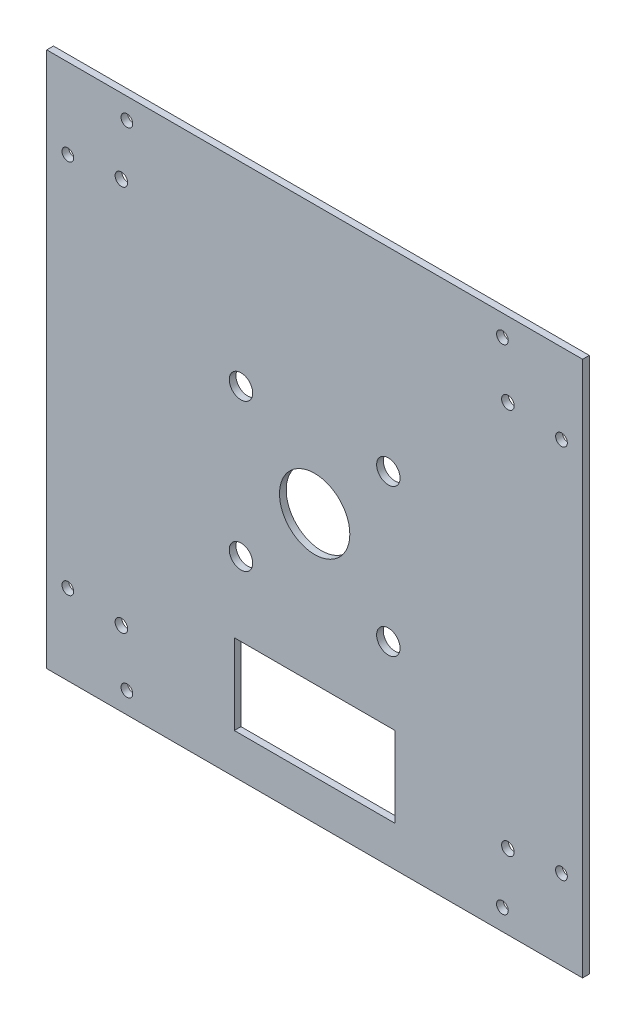
ISO-10303-21;
HEADER;
FILE_DESCRIPTION(('STEP AP214'),'2;1');
FILE_NAME('part.step','',(''),(''),'','','');
FILE_SCHEMA(('AUTOMOTIVE_DESIGN { 1 0 10303 214 1 1 1 1 }'));
ENDSEC;
DATA;
#1=APPLICATION_CONTEXT('core data for automotive mechanical design processes');
#2=APPLICATION_PROTOCOL_DEFINITION('international standard','automotive_design',2000,#1);
#3=PRODUCT_CONTEXT('',#1,'mechanical');
#4=PRODUCT('Part','Part','',(#3));
#5=PRODUCT_RELATED_PRODUCT_CATEGORY('part','',(#4));
#6=PRODUCT_DEFINITION_FORMATION('','',#4);
#7=PRODUCT_DEFINITION_CONTEXT('part definition',#1,'design');
#8=PRODUCT_DEFINITION('design','',#6,#7);
#9=PRODUCT_DEFINITION_SHAPE('','',#8);
#10=(LENGTH_UNIT() NAMED_UNIT(*) SI_UNIT(.MILLI.,.METRE.));
#11=(NAMED_UNIT(*) PLANE_ANGLE_UNIT() SI_UNIT($,.RADIAN.));
#12=(NAMED_UNIT(*) SI_UNIT($,.STERADIAN.) SOLID_ANGLE_UNIT());
#13=UNCERTAINTY_MEASURE_WITH_UNIT(LENGTH_MEASURE(1.E-05),#10,'distance_accuracy_value','');
#14=(GEOMETRIC_REPRESENTATION_CONTEXT(3) GLOBAL_UNCERTAINTY_ASSIGNED_CONTEXT((#13)) GLOBAL_UNIT_ASSIGNED_CONTEXT((#10,
#11,#12)) REPRESENTATION_CONTEXT('',''));
#15=CARTESIAN_POINT('',(0.,0.,0.));
#16=DIRECTION('',(0.,0.,1.));
#17=DIRECTION('',(1.,0.,0.));
#18=AXIS2_PLACEMENT_3D('',#15,#16,#17);
#19=CARTESIAN_POINT('',(0.,0.,-1.5875));
#20=DIRECTION('',(0.,0.,1.));
#21=DIRECTION('',(1.,0.,0.));
#22=AXIS2_PLACEMENT_3D('',#19,#20,#21);
#23=PLANE('',#22);
#24=DIRECTION('',(0.,1.,0.));
#25=VECTOR('',#24,1.);
#26=CARTESIAN_POINT('',(-127.,0.,-1.5875));
#27=LINE('',#26,#25);
#28=CARTESIAN_POINT('',(-127.,127.,-1.5875));
#29=VERTEX_POINT('',#28);
#30=CARTESIAN_POINT('',(-127.,-127.,-1.5875));
#31=VERTEX_POINT('',#30);
#32=EDGE_CURVE('E668',#29,#31,#27,.F.);
#33=ORIENTED_EDGE('',*,*,#32,.F.);
#34=DIRECTION('',(1.,0.,0.));
#35=VECTOR('',#34,1.);
#36=CARTESIAN_POINT('',(0.,127.,-1.5875));
#37=LINE('',#36,#35);
#38=CARTESIAN_POINT('',(127.,127.,-1.5875));
#39=VERTEX_POINT('',#38);
#40=EDGE_CURVE('E676',#39,#29,#37,.F.);
#41=ORIENTED_EDGE('',*,*,#40,.F.);
#42=DIRECTION('',(0.,1.,0.));
#43=VECTOR('',#42,1.);
#44=CARTESIAN_POINT('',(127.,0.,-1.5875));
#45=LINE('',#44,#43);
#46=CARTESIAN_POINT('',(127.,-127.,-1.5875));
#47=VERTEX_POINT('',#46);
#48=EDGE_CURVE('E679',#39,#47,#45,.F.);
#49=ORIENTED_EDGE('',*,*,#48,.T.);
#50=DIRECTION('',(1.,0.,0.));
#51=VECTOR('',#50,1.);
#52=CARTESIAN_POINT('',(0.,-127.,-1.5875));
#53=LINE('',#52,#51);
#54=EDGE_CURVE('E686',#47,#31,#53,.F.);
#55=ORIENTED_EDGE('',*,*,#54,.T.);
#56=EDGE_LOOP('',(#33,#41,#49,#55));
#57=FACE_BOUND('',#56,.T.);
#58=DIRECTION('',(1.,0.,0.));
#59=VECTOR('',#58,1.);
#60=CARTESIAN_POINT('',(0.,-69.85,-1.5875));
#61=LINE('',#60,#59);
#62=CARTESIAN_POINT('',(38.1,-69.85,-1.5875));
#63=VERTEX_POINT('',#62);
#64=CARTESIAN_POINT('',(-38.1,-69.85,-1.5875));
#65=VERTEX_POINT('',#64);
#66=EDGE_CURVE('E688',#63,#65,#61,.F.);
#67=ORIENTED_EDGE('',*,*,#66,.T.);
#68=DIRECTION('',(0.,1.,0.));
#69=VECTOR('',#68,1.);
#70=CARTESIAN_POINT('',(-38.1,0.,-1.5875));
#71=LINE('',#70,#69);
#72=CARTESIAN_POINT('',(-38.1,-107.95,-1.5875));
#73=VERTEX_POINT('',#72);
#74=EDGE_CURVE('E106',#65,#73,#71,.F.);
#75=ORIENTED_EDGE('',*,*,#74,.T.);
#76=DIRECTION('',(1.,0.,0.));
#77=VECTOR('',#76,1.);
#78=CARTESIAN_POINT('',(0.,-107.95,-1.5875));
#79=LINE('',#78,#77);
#80=CARTESIAN_POINT('',(38.1,-107.95,-1.5875));
#81=VERTEX_POINT('',#80);
#82=EDGE_CURVE('E97',#81,#73,#79,.F.);
#83=ORIENTED_EDGE('',*,*,#82,.F.);
#84=DIRECTION('',(0.,1.,0.));
#85=VECTOR('',#84,1.);
#86=CARTESIAN_POINT('',(38.1,0.,-1.5875));
#87=LINE('',#86,#85);
#88=EDGE_CURVE('E104',#63,#81,#87,.F.);
#89=ORIENTED_EDGE('',*,*,#88,.F.);
#90=EDGE_LOOP('',(#67,#75,#83,#89));
#91=FACE_BOUND('',#90,.T.);
#92=CARTESIAN_POINT('',(-89.,117.,-1.5875));
#93=DIRECTION('',(0.,0.,1.));
#94=DIRECTION('',(1.,0.,0.));
#95=AXIS2_PLACEMENT_3D('',#92,#93,#94);
#96=CIRCLE('',#95,2.77812500000001);
#97=CARTESIAN_POINT('',(-86.221875,117.,-1.5875));
#98=VERTEX_POINT('',#97);
#99=EDGE_CURVE('E118',#98,#98,#96,.T.);
#100=ORIENTED_EDGE('',*,*,#99,.T.);
#101=EDGE_LOOP('',(#100));
#102=FACE_BOUND('',#101,.T.);
#103=CARTESIAN_POINT('',(-89.,-117.,-1.5875));
#104=DIRECTION('',(0.,0.,1.));
#105=DIRECTION('',(1.,0.,0.));
#106=AXIS2_PLACEMENT_3D('',#103,#104,#105);
#107=CIRCLE('',#106,2.77812500000001);
#108=CARTESIAN_POINT('',(-86.221875,-117.,-1.5875));
#109=VERTEX_POINT('',#108);
#110=EDGE_CURVE('E206',#109,#109,#107,.T.);
#111=ORIENTED_EDGE('',*,*,#110,.T.);
#112=EDGE_LOOP('',(#111));
#113=FACE_BOUND('',#112,.T.);
#114=CARTESIAN_POINT('',(-117.,-89.,-1.5875));
#115=DIRECTION('',(0.,0.,1.));
#116=DIRECTION('',(1.,0.,0.));
#117=AXIS2_PLACEMENT_3D('',#114,#115,#116);
#118=CIRCLE('',#117,2.77812500000001);
#119=CARTESIAN_POINT('',(-114.221875,-89.,-1.5875));
#120=VERTEX_POINT('',#119);
#121=EDGE_CURVE('E210',#120,#120,#118,.T.);
#122=ORIENTED_EDGE('',*,*,#121,.T.);
#123=EDGE_LOOP('',(#122));
#124=FACE_BOUND('',#123,.T.);
#125=CARTESIAN_POINT('',(116.999999999999,-89.0000000000006,-1.5875));
#126=DIRECTION('',(0.,0.,1.));
#127=DIRECTION('',(1.,0.,0.));
#128=AXIS2_PLACEMENT_3D('',#125,#126,#127);
#129=CIRCLE('',#128,2.77812500000001);
#130=CARTESIAN_POINT('',(119.778124999999,-89.0000000000006,-1.5875));
#131=VERTEX_POINT('',#130);
#132=EDGE_CURVE('E214',#131,#131,#129,.T.);
#133=ORIENTED_EDGE('',*,*,#132,.T.);
#134=EDGE_LOOP('',(#133));
#135=FACE_BOUND('',#134,.T.);
#136=CARTESIAN_POINT('',(-117.,89.,-1.5875));
#137=DIRECTION('',(0.,0.,1.));
#138=DIRECTION('',(1.,0.,0.));
#139=AXIS2_PLACEMENT_3D('',#136,#137,#138);
#140=CIRCLE('',#139,2.77812500000001);
#141=CARTESIAN_POINT('',(-114.221875,89.,-1.5875));
#142=VERTEX_POINT('',#141);
#143=EDGE_CURVE('E218',#142,#142,#140,.T.);
#144=ORIENTED_EDGE('',*,*,#143,.T.);
#145=EDGE_LOOP('',(#144));
#146=FACE_BOUND('',#145,.T.);
#147=CARTESIAN_POINT('',(116.999999999999,89.0000000000006,-1.5875));
#148=DIRECTION('',(0.,0.,1.));
#149=DIRECTION('',(1.,0.,0.));
#150=AXIS2_PLACEMENT_3D('',#147,#148,#149);
#151=CIRCLE('',#150,2.77812500000001);
#152=CARTESIAN_POINT('',(119.778124999999,89.0000000000006,-1.5875));
#153=VERTEX_POINT('',#152);
#154=EDGE_CURVE('E222',#153,#153,#151,.T.);
#155=ORIENTED_EDGE('',*,*,#154,.T.);
#156=EDGE_LOOP('',(#155));
#157=FACE_BOUND('',#156,.T.);
#158=CARTESIAN_POINT('',(88.9999999999992,117.,-1.5875));
#159=DIRECTION('',(0.,0.,1.));
#160=DIRECTION('',(1.,0.,0.));
#161=AXIS2_PLACEMENT_3D('',#158,#159,#160);
#162=CIRCLE('',#161,2.77812500000001);
#163=CARTESIAN_POINT('',(91.7781249999992,117.,-1.5875));
#164=VERTEX_POINT('',#163);
#165=EDGE_CURVE('E226',#164,#164,#162,.T.);
#166=ORIENTED_EDGE('',*,*,#165,.T.);
#167=EDGE_LOOP('',(#166));
#168=FACE_BOUND('',#167,.T.);
#169=CARTESIAN_POINT('',(88.9999999999992,-117.,-1.5875));
#170=DIRECTION('',(0.,0.,1.));
#171=DIRECTION('',(1.,0.,0.));
#172=AXIS2_PLACEMENT_3D('',#169,#170,#171);
#173=CIRCLE('',#172,2.77812500000001);
#174=CARTESIAN_POINT('',(91.7781249999992,-117.,-1.5875));
#175=VERTEX_POINT('',#174);
#176=EDGE_CURVE('E230',#175,#175,#173,.T.);
#177=ORIENTED_EDGE('',*,*,#176,.T.);
#178=EDGE_LOOP('',(#177));
#179=FACE_BOUND('',#178,.T.);
#180=CARTESIAN_POINT('',(-91.6,91.6,-1.5875));
#181=DIRECTION('',(0.,0.,1.));
#182=DIRECTION('',(1.,0.,0.));
#183=AXIS2_PLACEMENT_3D('',#180,#181,#182);
#184=CIRCLE('',#183,2.97688);
#185=CARTESIAN_POINT('',(-88.62312,91.6,-1.5875));
#186=VERTEX_POINT('',#185);
#187=EDGE_CURVE('E234',#186,#186,#184,.T.);
#188=ORIENTED_EDGE('',*,*,#187,.T.);
#189=EDGE_LOOP('',(#188));
#190=FACE_BOUND('',#189,.T.);
#191=CARTESIAN_POINT('',(91.5999999999994,91.6000000000006,-1.5875));
#192=DIRECTION('',(0.,0.,1.));
#193=DIRECTION('',(1.,0.,0.));
#194=AXIS2_PLACEMENT_3D('',#191,#192,#193);
#195=CIRCLE('',#194,2.97688);
#196=CARTESIAN_POINT('',(94.5768799999994,91.6000000000006,-1.5875));
#197=VERTEX_POINT('',#196);
#198=EDGE_CURVE('E238',#197,#197,#195,.T.);
#199=ORIENTED_EDGE('',*,*,#198,.T.);
#200=EDGE_LOOP('',(#199));
#201=FACE_BOUND('',#200,.T.);
#202=CARTESIAN_POINT('',(91.5999999999994,-91.6000000000006,-1.5875));
#203=DIRECTION('',(0.,0.,1.));
#204=DIRECTION('',(1.,0.,0.));
#205=AXIS2_PLACEMENT_3D('',#202,#203,#204);
#206=CIRCLE('',#205,2.97688);
#207=CARTESIAN_POINT('',(94.5768799999994,-91.6000000000006,-1.5875));
#208=VERTEX_POINT('',#207);
#209=EDGE_CURVE('E242',#208,#208,#206,.T.);
#210=ORIENTED_EDGE('',*,*,#209,.T.);
#211=EDGE_LOOP('',(#210));
#212=FACE_BOUND('',#211,.T.);
#213=CARTESIAN_POINT('',(-91.6,-91.6,-1.5875));
#214=DIRECTION('',(0.,0.,1.));
#215=DIRECTION('',(1.,0.,0.));
#216=AXIS2_PLACEMENT_3D('',#213,#214,#215);
#217=CIRCLE('',#216,2.97688);
#218=CARTESIAN_POINT('',(-88.62312,-91.6,-1.5875));
#219=VERTEX_POINT('',#218);
#220=EDGE_CURVE('E246',#219,#219,#217,.T.);
#221=ORIENTED_EDGE('',*,*,#220,.T.);
#222=EDGE_LOOP('',(#221));
#223=FACE_BOUND('',#222,.T.);
#224=CARTESIAN_POINT('',(0.,0.,-1.5875));
#225=DIRECTION('',(0.,0.,1.));
#226=DIRECTION('',(1.,0.,0.));
#227=AXIS2_PLACEMENT_3D('',#224,#225,#226);
#228=CIRCLE('',#227,16.66875);
#229=CARTESIAN_POINT('',(16.66875,0.,-1.5875));
#230=VERTEX_POINT('',#229);
#231=EDGE_CURVE('E250',#230,#230,#228,.T.);
#232=ORIENTED_EDGE('',*,*,#231,.T.);
#233=EDGE_LOOP('',(#232));
#234=FACE_BOUND('',#233,.T.);
#235=CARTESIAN_POINT('',(-34.925,34.925,-1.5875));
#236=DIRECTION('',(0.,0.,1.));
#237=DIRECTION('',(1.,0.,0.));
#238=AXIS2_PLACEMENT_3D('',#235,#236,#237);
#239=CIRCLE('',#238,5.55625);
#240=CARTESIAN_POINT('',(-29.36875,34.925,-1.5875));
#241=VERTEX_POINT('',#240);
#242=EDGE_CURVE('E254',#241,#241,#239,.T.);
#243=ORIENTED_EDGE('',*,*,#242,.T.);
#244=EDGE_LOOP('',(#243));
#245=FACE_BOUND('',#244,.T.);
#246=CARTESIAN_POINT('',(34.9249999999997,34.9250000000002,-1.5875));
#247=DIRECTION('',(0.,0.,1.));
#248=DIRECTION('',(1.,0.,0.));
#249=AXIS2_PLACEMENT_3D('',#246,#247,#248);
#250=CIRCLE('',#249,5.55625);
#251=CARTESIAN_POINT('',(40.4812499999997,34.9250000000002,-1.5875));
#252=VERTEX_POINT('',#251);
#253=EDGE_CURVE('E258',#252,#252,#250,.T.);
#254=ORIENTED_EDGE('',*,*,#253,.T.);
#255=EDGE_LOOP('',(#254));
#256=FACE_BOUND('',#255,.T.);
#257=CARTESIAN_POINT('',(34.9249999999997,-34.9250000000002,-1.5875));
#258=DIRECTION('',(0.,0.,1.));
#259=DIRECTION('',(1.,0.,0.));
#260=AXIS2_PLACEMENT_3D('',#257,#258,#259);
#261=CIRCLE('',#260,5.55625);
#262=CARTESIAN_POINT('',(40.4812499999997,-34.9250000000002,-1.5875));
#263=VERTEX_POINT('',#262);
#264=EDGE_CURVE('E261',#263,#263,#261,.T.);
#265=ORIENTED_EDGE('',*,*,#264,.T.);
#266=EDGE_LOOP('',(#265));
#267=FACE_BOUND('',#266,.T.);
#268=CARTESIAN_POINT('',(-34.925,-34.925,-1.5875));
#269=DIRECTION('',(0.,0.,1.));
#270=DIRECTION('',(1.,0.,0.));
#271=AXIS2_PLACEMENT_3D('',#268,#269,#270);
#272=CIRCLE('',#271,5.55625);
#273=CARTESIAN_POINT('',(-29.36875,-34.925,-1.5875));
#274=VERTEX_POINT('',#273);
#275=EDGE_CURVE('E20',#274,#274,#272,.T.);
#276=ORIENTED_EDGE('',*,*,#275,.T.);
#277=EDGE_LOOP('',(#276));
#278=FACE_BOUND('',#277,.T.);
#279=ADVANCED_FACE('F17',(#57,#91,#102,#113,#124,#135,#146,#157,#168,#179,#190,#201,#212,#223,
#234,#245,#256,#267,#278),#23,.F.);
#280=CARTESIAN_POINT('',(-34.925,-34.925,-23.8125));
#281=DIRECTION('',(0.,0.,1.));
#282=DIRECTION('',(1.,0.,0.));
#283=AXIS2_PLACEMENT_3D('',#280,#281,#282);
#284=CYLINDRICAL_SURFACE('',#283,5.55625);
#285=CARTESIAN_POINT('',(-34.925,-34.925,1.5875));
#286=DIRECTION('',(0.,0.,1.));
#287=DIRECTION('',(1.,0.,0.));
#288=AXIS2_PLACEMENT_3D('',#285,#286,#287);
#289=CIRCLE('',#288,5.55625);
#290=CARTESIAN_POINT('',(-29.36875,-34.925,1.5875));
#291=VERTEX_POINT('',#290);
#292=EDGE_CURVE('E199',#291,#291,#289,.F.);
#293=ORIENTED_EDGE('',*,*,#292,.F.);
#294=EDGE_LOOP('',(#293));
#295=FACE_BOUND('',#294,.T.);
#296=ORIENTED_EDGE('',*,*,#275,.F.);
#297=EDGE_LOOP('',(#296));
#298=FACE_BOUND('',#297,.T.);
#299=ADVANCED_FACE('F272',(#295,#298),#284,.F.);
#300=CARTESIAN_POINT('',(34.9249999999997,-34.9250000000002,-23.8125));
#301=DIRECTION('',(0.,0.,1.));
#302=DIRECTION('',(1.,0.,0.));
#303=AXIS2_PLACEMENT_3D('',#300,#301,#302);
#304=CYLINDRICAL_SURFACE('',#303,5.55625);
#305=CARTESIAN_POINT('',(34.9249999999997,-34.9250000000002,1.5875));
#306=DIRECTION('',(0.,0.,1.));
#307=DIRECTION('',(1.,0.,0.));
#308=AXIS2_PLACEMENT_3D('',#305,#306,#307);
#309=CIRCLE('',#308,5.55625);
#310=CARTESIAN_POINT('',(40.4812499999997,-34.9250000000002,1.5875));
#311=VERTEX_POINT('',#310);
#312=EDGE_CURVE('E195',#311,#311,#309,.F.);
#313=ORIENTED_EDGE('',*,*,#312,.F.);
#314=EDGE_LOOP('',(#313));
#315=FACE_BOUND('',#314,.T.);
#316=ORIENTED_EDGE('',*,*,#264,.F.);
#317=EDGE_LOOP('',(#316));
#318=FACE_BOUND('',#317,.T.);
#319=ADVANCED_FACE('F274',(#315,#318),#304,.F.);
#320=CARTESIAN_POINT('',(34.9249999999997,34.9250000000002,-23.8125));
#321=DIRECTION('',(0.,0.,1.));
#322=DIRECTION('',(1.,0.,0.));
#323=AXIS2_PLACEMENT_3D('',#320,#321,#322);
#324=CYLINDRICAL_SURFACE('',#323,5.55625);
#325=CARTESIAN_POINT('',(34.9249999999997,34.9250000000002,1.5875));
#326=DIRECTION('',(0.,0.,1.));
#327=DIRECTION('',(1.,0.,0.));
#328=AXIS2_PLACEMENT_3D('',#325,#326,#327);
#329=CIRCLE('',#328,5.55625);
#330=CARTESIAN_POINT('',(40.4812499999997,34.9250000000002,1.5875));
#331=VERTEX_POINT('',#330);
#332=EDGE_CURVE('E191',#331,#331,#329,.F.);
#333=ORIENTED_EDGE('',*,*,#332,.F.);
#334=EDGE_LOOP('',(#333));
#335=FACE_BOUND('',#334,.T.);
#336=ORIENTED_EDGE('',*,*,#253,.F.);
#337=EDGE_LOOP('',(#336));
#338=FACE_BOUND('',#337,.T.);
#339=ADVANCED_FACE('F281',(#335,#338),#324,.F.);
#340=CARTESIAN_POINT('',(-34.925,34.925,-23.8125));
#341=DIRECTION('',(0.,0.,1.));
#342=DIRECTION('',(1.,0.,0.));
#343=AXIS2_PLACEMENT_3D('',#340,#341,#342);
#344=CYLINDRICAL_SURFACE('',#343,5.55625);
#345=CARTESIAN_POINT('',(-34.925,34.925,1.5875));
#346=DIRECTION('',(0.,0.,1.));
#347=DIRECTION('',(1.,0.,0.));
#348=AXIS2_PLACEMENT_3D('',#345,#346,#347);
#349=CIRCLE('',#348,5.55625);
#350=CARTESIAN_POINT('',(-29.36875,34.925,1.5875));
#351=VERTEX_POINT('',#350);
#352=EDGE_CURVE('E187',#351,#351,#349,.F.);
#353=ORIENTED_EDGE('',*,*,#352,.F.);
#354=EDGE_LOOP('',(#353));
#355=FACE_BOUND('',#354,.T.);
#356=ORIENTED_EDGE('',*,*,#242,.F.);
#357=EDGE_LOOP('',(#356));
#358=FACE_BOUND('',#357,.T.);
#359=ADVANCED_FACE('F373',(#355,#358),#344,.F.);
#360=CARTESIAN_POINT('',(0.,0.,-23.8125));
#361=DIRECTION('',(0.,0.,1.));
#362=DIRECTION('',(1.,0.,0.));
#363=AXIS2_PLACEMENT_3D('',#360,#361,#362);
#364=CYLINDRICAL_SURFACE('',#363,16.66875);
#365=CARTESIAN_POINT('',(0.,0.,1.5875));
#366=DIRECTION('',(0.,0.,1.));
#367=DIRECTION('',(1.,0.,0.));
#368=AXIS2_PLACEMENT_3D('',#365,#366,#367);
#369=CIRCLE('',#368,16.66875);
#370=CARTESIAN_POINT('',(16.66875,0.,1.5875));
#371=VERTEX_POINT('',#370);
#372=EDGE_CURVE('E183',#371,#371,#369,.F.);
#373=ORIENTED_EDGE('',*,*,#372,.F.);
#374=EDGE_LOOP('',(#373));
#375=FACE_BOUND('',#374,.T.);
#376=ORIENTED_EDGE('',*,*,#231,.F.);
#377=EDGE_LOOP('',(#376));
#378=FACE_BOUND('',#377,.T.);
#379=ADVANCED_FACE('F369',(#375,#378),#364,.F.);
#380=CARTESIAN_POINT('',(-91.6,-91.6,-23.8125));
#381=DIRECTION('',(0.,0.,1.));
#382=DIRECTION('',(1.,0.,0.));
#383=AXIS2_PLACEMENT_3D('',#380,#381,#382);
#384=CYLINDRICAL_SURFACE('',#383,2.97688);
#385=CARTESIAN_POINT('',(-91.6,-91.6,1.5875));
#386=DIRECTION('',(0.,0.,1.));
#387=DIRECTION('',(1.,0.,0.));
#388=AXIS2_PLACEMENT_3D('',#385,#386,#387);
#389=CIRCLE('',#388,2.97688);
#390=CARTESIAN_POINT('',(-88.62312,-91.6,1.5875));
#391=VERTEX_POINT('',#390);
#392=EDGE_CURVE('E179',#391,#391,#389,.F.);
#393=ORIENTED_EDGE('',*,*,#392,.F.);
#394=EDGE_LOOP('',(#393));
#395=FACE_BOUND('',#394,.T.);
#396=ORIENTED_EDGE('',*,*,#220,.F.);
#397=EDGE_LOOP('',(#396));
#398=FACE_BOUND('',#397,.T.);
#399=ADVANCED_FACE('F365',(#395,#398),#384,.F.);
#400=CARTESIAN_POINT('',(91.5999999999994,-91.6000000000006,-23.8125));
#401=DIRECTION('',(0.,0.,1.));
#402=DIRECTION('',(1.,0.,0.));
#403=AXIS2_PLACEMENT_3D('',#400,#401,#402);
#404=CYLINDRICAL_SURFACE('',#403,2.97688);
#405=CARTESIAN_POINT('',(91.5999999999994,-91.6000000000006,1.5875));
#406=DIRECTION('',(0.,0.,1.));
#407=DIRECTION('',(1.,0.,0.));
#408=AXIS2_PLACEMENT_3D('',#405,#406,#407);
#409=CIRCLE('',#408,2.97688);
#410=CARTESIAN_POINT('',(94.5768799999994,-91.6000000000006,1.5875));
#411=VERTEX_POINT('',#410);
#412=EDGE_CURVE('E175',#411,#411,#409,.F.);
#413=ORIENTED_EDGE('',*,*,#412,.F.);
#414=EDGE_LOOP('',(#413));
#415=FACE_BOUND('',#414,.T.);
#416=ORIENTED_EDGE('',*,*,#209,.F.);
#417=EDGE_LOOP('',(#416));
#418=FACE_BOUND('',#417,.T.);
#419=ADVANCED_FACE('F361',(#415,#418),#404,.F.);
#420=CARTESIAN_POINT('',(91.5999999999994,91.6000000000006,-23.8125));
#421=DIRECTION('',(0.,0.,1.));
#422=DIRECTION('',(1.,0.,0.));
#423=AXIS2_PLACEMENT_3D('',#420,#421,#422);
#424=CYLINDRICAL_SURFACE('',#423,2.97688);
#425=CARTESIAN_POINT('',(91.5999999999994,91.6000000000006,1.5875));
#426=DIRECTION('',(0.,0.,1.));
#427=DIRECTION('',(1.,0.,0.));
#428=AXIS2_PLACEMENT_3D('',#425,#426,#427);
#429=CIRCLE('',#428,2.97688);
#430=CARTESIAN_POINT('',(94.5768799999994,91.6000000000006,1.5875));
#431=VERTEX_POINT('',#430);
#432=EDGE_CURVE('E171',#431,#431,#429,.F.);
#433=ORIENTED_EDGE('',*,*,#432,.F.);
#434=EDGE_LOOP('',(#433));
#435=FACE_BOUND('',#434,.T.);
#436=ORIENTED_EDGE('',*,*,#198,.F.);
#437=EDGE_LOOP('',(#436));
#438=FACE_BOUND('',#437,.T.);
#439=ADVANCED_FACE('F357',(#435,#438),#424,.F.);
#440=CARTESIAN_POINT('',(-91.6,91.6,-23.8125));
#441=DIRECTION('',(0.,0.,1.));
#442=DIRECTION('',(1.,0.,0.));
#443=AXIS2_PLACEMENT_3D('',#440,#441,#442);
#444=CYLINDRICAL_SURFACE('',#443,2.97688);
#445=CARTESIAN_POINT('',(-91.6,91.6,1.5875));
#446=DIRECTION('',(0.,0.,1.));
#447=DIRECTION('',(1.,0.,0.));
#448=AXIS2_PLACEMENT_3D('',#445,#446,#447);
#449=CIRCLE('',#448,2.97688);
#450=CARTESIAN_POINT('',(-88.62312,91.6,1.5875));
#451=VERTEX_POINT('',#450);
#452=EDGE_CURVE('E167',#451,#451,#449,.F.);
#453=ORIENTED_EDGE('',*,*,#452,.F.);
#454=EDGE_LOOP('',(#453));
#455=FACE_BOUND('',#454,.T.);
#456=ORIENTED_EDGE('',*,*,#187,.F.);
#457=EDGE_LOOP('',(#456));
#458=FACE_BOUND('',#457,.T.);
#459=ADVANCED_FACE('F353',(#455,#458),#444,.F.);
#460=CARTESIAN_POINT('',(88.9999999999992,-117.,-6.0325));
#461=DIRECTION('',(0.,0.,1.));
#462=DIRECTION('',(1.,0.,0.));
#463=AXIS2_PLACEMENT_3D('',#460,#461,#462);
#464=CYLINDRICAL_SURFACE('',#463,2.77812500000001);
#465=CARTESIAN_POINT('',(88.9999999999992,-117.,1.5875));
#466=DIRECTION('',(0.,0.,1.));
#467=DIRECTION('',(1.,0.,0.));
#468=AXIS2_PLACEMENT_3D('',#465,#466,#467);
#469=CIRCLE('',#468,2.77812500000001);
#470=CARTESIAN_POINT('',(91.7781249999992,-117.,1.5875));
#471=VERTEX_POINT('',#470);
#472=EDGE_CURVE('E163',#471,#471,#469,.F.);
#473=ORIENTED_EDGE('',*,*,#472,.F.);
#474=EDGE_LOOP('',(#473));
#475=FACE_BOUND('',#474,.T.);
#476=ORIENTED_EDGE('',*,*,#176,.F.);
#477=EDGE_LOOP('',(#476));
#478=FACE_BOUND('',#477,.T.);
#479=ADVANCED_FACE('F349',(#475,#478),#464,.F.);
#480=CARTESIAN_POINT('',(88.9999999999992,117.,-6.0325));
#481=DIRECTION('',(0.,0.,1.));
#482=DIRECTION('',(1.,0.,0.));
#483=AXIS2_PLACEMENT_3D('',#480,#481,#482);
#484=CYLINDRICAL_SURFACE('',#483,2.77812500000001);
#485=CARTESIAN_POINT('',(88.9999999999992,117.,1.5875));
#486=DIRECTION('',(0.,0.,1.));
#487=DIRECTION('',(1.,0.,0.));
#488=AXIS2_PLACEMENT_3D('',#485,#486,#487);
#489=CIRCLE('',#488,2.77812500000001);
#490=CARTESIAN_POINT('',(91.7781249999992,117.,1.5875));
#491=VERTEX_POINT('',#490);
#492=EDGE_CURVE('E159',#491,#491,#489,.F.);
#493=ORIENTED_EDGE('',*,*,#492,.F.);
#494=EDGE_LOOP('',(#493));
#495=FACE_BOUND('',#494,.T.);
#496=ORIENTED_EDGE('',*,*,#165,.F.);
#497=EDGE_LOOP('',(#496));
#498=FACE_BOUND('',#497,.T.);
#499=ADVANCED_FACE('F345',(#495,#498),#484,.F.);
#500=CARTESIAN_POINT('',(116.999999999999,89.0000000000006,-6.0325));
#501=DIRECTION('',(0.,0.,1.));
#502=DIRECTION('',(1.,0.,0.));
#503=AXIS2_PLACEMENT_3D('',#500,#501,#502);
#504=CYLINDRICAL_SURFACE('',#503,2.77812500000001);
#505=CARTESIAN_POINT('',(116.999999999999,89.0000000000006,1.5875));
#506=DIRECTION('',(0.,0.,1.));
#507=DIRECTION('',(1.,0.,0.));
#508=AXIS2_PLACEMENT_3D('',#505,#506,#507);
#509=CIRCLE('',#508,2.77812500000001);
#510=CARTESIAN_POINT('',(119.778124999999,89.0000000000006,1.5875));
#511=VERTEX_POINT('',#510);
#512=EDGE_CURVE('E155',#511,#511,#509,.F.);
#513=ORIENTED_EDGE('',*,*,#512,.F.);
#514=EDGE_LOOP('',(#513));
#515=FACE_BOUND('',#514,.T.);
#516=ORIENTED_EDGE('',*,*,#154,.F.);
#517=EDGE_LOOP('',(#516));
#518=FACE_BOUND('',#517,.T.);
#519=ADVANCED_FACE('F341',(#515,#518),#504,.F.);
#520=CARTESIAN_POINT('',(-117.,89.,-6.0325));
#521=DIRECTION('',(0.,0.,1.));
#522=DIRECTION('',(1.,0.,0.));
#523=AXIS2_PLACEMENT_3D('',#520,#521,#522);
#524=CYLINDRICAL_SURFACE('',#523,2.77812500000001);
#525=CARTESIAN_POINT('',(-117.,89.,1.5875));
#526=DIRECTION('',(0.,0.,1.));
#527=DIRECTION('',(1.,0.,0.));
#528=AXIS2_PLACEMENT_3D('',#525,#526,#527);
#529=CIRCLE('',#528,2.77812500000001);
#530=CARTESIAN_POINT('',(-114.221875,89.,1.5875));
#531=VERTEX_POINT('',#530);
#532=EDGE_CURVE('E151',#531,#531,#529,.F.);
#533=ORIENTED_EDGE('',*,*,#532,.F.);
#534=EDGE_LOOP('',(#533));
#535=FACE_BOUND('',#534,.T.);
#536=ORIENTED_EDGE('',*,*,#143,.F.);
#537=EDGE_LOOP('',(#536));
#538=FACE_BOUND('',#537,.T.);
#539=ADVANCED_FACE('F337',(#535,#538),#524,.F.);
#540=CARTESIAN_POINT('',(116.999999999999,-89.0000000000006,-6.0325));
#541=DIRECTION('',(0.,0.,1.));
#542=DIRECTION('',(1.,0.,0.));
#543=AXIS2_PLACEMENT_3D('',#540,#541,#542);
#544=CYLINDRICAL_SURFACE('',#543,2.77812500000001);
#545=CARTESIAN_POINT('',(116.999999999999,-89.0000000000006,1.5875));
#546=DIRECTION('',(0.,0.,1.));
#547=DIRECTION('',(1.,0.,0.));
#548=AXIS2_PLACEMENT_3D('',#545,#546,#547);
#549=CIRCLE('',#548,2.77812500000001);
#550=CARTESIAN_POINT('',(119.778124999999,-89.0000000000006,1.5875));
#551=VERTEX_POINT('',#550);
#552=EDGE_CURVE('E147',#551,#551,#549,.F.);
#553=ORIENTED_EDGE('',*,*,#552,.F.);
#554=EDGE_LOOP('',(#553));
#555=FACE_BOUND('',#554,.T.);
#556=ORIENTED_EDGE('',*,*,#132,.F.);
#557=EDGE_LOOP('',(#556));
#558=FACE_BOUND('',#557,.T.);
#559=ADVANCED_FACE('F333',(#555,#558),#544,.F.);
#560=CARTESIAN_POINT('',(-117.,-89.,-6.0325));
#561=DIRECTION('',(0.,0.,1.));
#562=DIRECTION('',(1.,0.,0.));
#563=AXIS2_PLACEMENT_3D('',#560,#561,#562);
#564=CYLINDRICAL_SURFACE('',#563,2.77812500000001);
#565=CARTESIAN_POINT('',(-117.,-89.,1.5875));
#566=DIRECTION('',(0.,0.,1.));
#567=DIRECTION('',(1.,0.,0.));
#568=AXIS2_PLACEMENT_3D('',#565,#566,#567);
#569=CIRCLE('',#568,2.77812500000001);
#570=CARTESIAN_POINT('',(-114.221875,-89.,1.5875));
#571=VERTEX_POINT('',#570);
#572=EDGE_CURVE('E143',#571,#571,#569,.F.);
#573=ORIENTED_EDGE('',*,*,#572,.F.);
#574=EDGE_LOOP('',(#573));
#575=FACE_BOUND('',#574,.T.);
#576=ORIENTED_EDGE('',*,*,#121,.F.);
#577=EDGE_LOOP('',(#576));
#578=FACE_BOUND('',#577,.T.);
#579=ADVANCED_FACE('F329',(#575,#578),#564,.F.);
#580=CARTESIAN_POINT('',(-89.,-117.,-6.0325));
#581=DIRECTION('',(0.,0.,1.));
#582=DIRECTION('',(1.,0.,0.));
#583=AXIS2_PLACEMENT_3D('',#580,#581,#582);
#584=CYLINDRICAL_SURFACE('',#583,2.77812500000001);
#585=CARTESIAN_POINT('',(-89.,-117.,1.5875));
#586=DIRECTION('',(0.,0.,1.));
#587=DIRECTION('',(1.,0.,0.));
#588=AXIS2_PLACEMENT_3D('',#585,#586,#587);
#589=CIRCLE('',#588,2.77812500000001);
#590=CARTESIAN_POINT('',(-86.221875,-117.,1.5875));
#591=VERTEX_POINT('',#590);
#592=EDGE_CURVE('E139',#591,#591,#589,.F.);
#593=ORIENTED_EDGE('',*,*,#592,.F.);
#594=EDGE_LOOP('',(#593));
#595=FACE_BOUND('',#594,.T.);
#596=ORIENTED_EDGE('',*,*,#110,.F.);
#597=EDGE_LOOP('',(#596));
#598=FACE_BOUND('',#597,.T.);
#599=ADVANCED_FACE('F325',(#595,#598),#584,.F.);
#600=CARTESIAN_POINT('',(-89.,117.,-6.0325));
#601=DIRECTION('',(0.,0.,1.));
#602=DIRECTION('',(1.,0.,0.));
#603=AXIS2_PLACEMENT_3D('',#600,#601,#602);
#604=CYLINDRICAL_SURFACE('',#603,2.77812500000001);
#605=CARTESIAN_POINT('',(-89.,117.,1.5875));
#606=DIRECTION('',(0.,0.,1.));
#607=DIRECTION('',(1.,0.,0.));
#608=AXIS2_PLACEMENT_3D('',#605,#606,#607);
#609=CIRCLE('',#608,2.77812500000001);
#610=CARTESIAN_POINT('',(-86.221875,117.,1.5875));
#611=VERTEX_POINT('',#610);
#612=EDGE_CURVE('E134',#611,#611,#609,.F.);
#613=ORIENTED_EDGE('',*,*,#612,.F.);
#614=EDGE_LOOP('',(#613));
#615=FACE_BOUND('',#614,.T.);
#616=ORIENTED_EDGE('',*,*,#99,.F.);
#617=EDGE_LOOP('',(#616));
#618=FACE_BOUND('',#617,.T.);
#619=ADVANCED_FACE('F322',(#615,#618),#604,.F.);
#620=CARTESIAN_POINT('',(38.1,0.,1.5875));
#621=DIRECTION('',(-1.,0.,0.));
#622=DIRECTION('',(0.,0.,1.));
#623=AXIS2_PLACEMENT_3D('',#620,#621,#622);
#624=PLANE('',#623);
#625=DIRECTION('',(0.,1.,0.));
#626=VECTOR('',#625,1.);
#627=CARTESIAN_POINT('',(38.1,0.,1.5875));
#628=LINE('',#627,#626);
#629=CARTESIAN_POINT('',(38.1,-69.85,1.5875));
#630=VERTEX_POINT('',#629);
#631=CARTESIAN_POINT('',(38.1,-107.95,1.5875));
#632=VERTEX_POINT('',#631);
#633=EDGE_CURVE('E138',#630,#632,#628,.F.);
#634=ORIENTED_EDGE('',*,*,#633,.F.);
#635=DIRECTION('',(0.,0.,1.));
#636=VECTOR('',#635,1.);
#637=CARTESIAN_POINT('',(38.1,-69.85,1.5875));
#638=LINE('',#637,#636);
#639=EDGE_CURVE('E115',#630,#63,#638,.F.);
#640=ORIENTED_EDGE('',*,*,#639,.T.);
#641=ORIENTED_EDGE('',*,*,#88,.T.);
#642=DIRECTION('',(0.,0.,1.));
#643=VECTOR('',#642,1.);
#644=CARTESIAN_POINT('',(38.1,-107.95,1.5875));
#645=LINE('',#644,#643);
#646=EDGE_CURVE('E109',#632,#81,#645,.F.);
#647=ORIENTED_EDGE('',*,*,#646,.F.);
#648=EDGE_LOOP('',(#634,#640,#641,#647));
#649=FACE_BOUND('',#648,.T.);
#650=ADVANCED_FACE('F112',(#649),#624,.T.);
#651=CARTESIAN_POINT('',(0.,-107.95,1.5875));
#652=DIRECTION('',(0.,1.,0.));
#653=DIRECTION('',(0.,0.,1.));
#654=AXIS2_PLACEMENT_3D('',#651,#652,#653);
#655=PLANE('',#654);
#656=DIRECTION('',(1.,0.,0.));
#657=VECTOR('',#656,1.);
#658=CARTESIAN_POINT('',(0.,-107.95,1.5875));
#659=LINE('',#658,#657);
#660=CARTESIAN_POINT('',(-38.1,-107.95,1.5875));
#661=VERTEX_POINT('',#660);
#662=EDGE_CURVE('E122',#632,#661,#659,.F.);
#663=ORIENTED_EDGE('',*,*,#662,.F.);
#664=ORIENTED_EDGE('',*,*,#646,.T.);
#665=ORIENTED_EDGE('',*,*,#82,.T.);
#666=DIRECTION('',(0.,0.,1.));
#667=VECTOR('',#666,1.);
#668=CARTESIAN_POINT('',(-38.1,-107.95,1.5875));
#669=LINE('',#668,#667);
#670=EDGE_CURVE('E125',#73,#661,#669,.T.);
#671=ORIENTED_EDGE('',*,*,#670,.T.);
#672=EDGE_LOOP('',(#663,#664,#665,#671));
#673=FACE_BOUND('',#672,.T.);
#674=ADVANCED_FACE('F120',(#673),#655,.T.);
#675=CARTESIAN_POINT('',(-38.1,0.,1.5875));
#676=DIRECTION('',(-1.,0.,0.));
#677=DIRECTION('',(0.,0.,1.));
#678=AXIS2_PLACEMENT_3D('',#675,#676,#677);
#679=PLANE('',#678);
#680=DIRECTION('',(0.,0.,1.));
#681=VECTOR('',#680,1.);
#682=CARTESIAN_POINT('',(-38.1,-69.85,1.5875));
#683=LINE('',#682,#681);
#684=CARTESIAN_POINT('',(-38.1,-69.85,1.5875));
#685=VERTEX_POINT('',#684);
#686=EDGE_CURVE('E645',#65,#685,#683,.T.);
#687=ORIENTED_EDGE('',*,*,#686,.T.);
#688=DIRECTION('',(0.,1.,0.));
#689=VECTOR('',#688,1.);
#690=CARTESIAN_POINT('',(-38.1,0.,1.5875));
#691=LINE('',#690,#689);
#692=EDGE_CURVE('E648',#661,#685,#691,.T.);
#693=ORIENTED_EDGE('',*,*,#692,.F.);
#694=ORIENTED_EDGE('',*,*,#670,.F.);
#695=ORIENTED_EDGE('',*,*,#74,.F.);
#696=EDGE_LOOP('',(#687,#693,#694,#695));
#697=FACE_BOUND('',#696,.T.);
#698=ADVANCED_FACE('F313',(#697),#679,.F.);
#699=CARTESIAN_POINT('',(0.,-69.85,1.5875));
#700=DIRECTION('',(0.,1.,0.));
#701=DIRECTION('',(0.,0.,1.));
#702=AXIS2_PLACEMENT_3D('',#699,#700,#701);
#703=PLANE('',#702);
#704=ORIENTED_EDGE('',*,*,#639,.F.);
#705=DIRECTION('',(1.,0.,0.));
#706=VECTOR('',#705,1.);
#707=CARTESIAN_POINT('',(0.,-69.85,1.5875));
#708=LINE('',#707,#706);
#709=EDGE_CURVE('E652',#685,#630,#708,.T.);
#710=ORIENTED_EDGE('',*,*,#709,.F.);
#711=ORIENTED_EDGE('',*,*,#686,.F.);
#712=ORIENTED_EDGE('',*,*,#66,.F.);
#713=EDGE_LOOP('',(#704,#710,#711,#712));
#714=FACE_BOUND('',#713,.T.);
#715=ADVANCED_FACE('F309',(#714),#703,.F.);
#716=CARTESIAN_POINT('',(0.,-127.,1.5875));
#717=DIRECTION('',(0.,1.,0.));
#718=DIRECTION('',(0.,0.,1.));
#719=AXIS2_PLACEMENT_3D('',#716,#717,#718);
#720=PLANE('',#719);
#721=DIRECTION('',(0.,0.,1.));
#722=VECTOR('',#721,1.);
#723=CARTESIAN_POINT('',(127.,-127.,1.5875));
#724=LINE('',#723,#722);
#725=CARTESIAN_POINT('',(127.,-127.,1.5875));
#726=VERTEX_POINT('',#725);
#727=EDGE_CURVE('E683',#47,#726,#724,.T.);
#728=ORIENTED_EDGE('',*,*,#727,.T.);
#729=DIRECTION('',(1.,0.,0.));
#730=VECTOR('',#729,1.);
#731=CARTESIAN_POINT('',(0.,-127.,1.5875));
#732=LINE('',#731,#730);
#733=CARTESIAN_POINT('',(-127.,-127.,1.5875));
#734=VERTEX_POINT('',#733);
#735=EDGE_CURVE('E654',#734,#726,#732,.T.);
#736=ORIENTED_EDGE('',*,*,#735,.F.);
#737=DIRECTION('',(0.,0.,1.));
#738=VECTOR('',#737,1.);
#739=CARTESIAN_POINT('',(-127.,-127.,1.5875));
#740=LINE('',#739,#738);
#741=EDGE_CURVE('E664',#31,#734,#740,.T.);
#742=ORIENTED_EDGE('',*,*,#741,.F.);
#743=ORIENTED_EDGE('',*,*,#54,.F.);
#744=EDGE_LOOP('',(#728,#736,#742,#743));
#745=FACE_BOUND('',#744,.T.);
#746=ADVANCED_FACE('F305',(#745),#720,.F.);
#747=CARTESIAN_POINT('',(127.,0.,1.5875));
#748=DIRECTION('',(-1.,0.,0.));
#749=DIRECTION('',(0.,0.,1.));
#750=AXIS2_PLACEMENT_3D('',#747,#748,#749);
#751=PLANE('',#750);
#752=DIRECTION('',(0.,0.,1.));
#753=VECTOR('',#752,1.);
#754=CARTESIAN_POINT('',(127.,127.,1.5875));
#755=LINE('',#754,#753);
#756=CARTESIAN_POINT('',(127.,127.,1.5875));
#757=VERTEX_POINT('',#756);
#758=EDGE_CURVE('E672',#757,#39,#755,.F.);
#759=ORIENTED_EDGE('',*,*,#758,.F.);
#760=DIRECTION('',(0.,1.,0.));
#761=VECTOR('',#760,1.);
#762=CARTESIAN_POINT('',(127.,0.,1.5875));
#763=LINE('',#762,#761);
#764=EDGE_CURVE('E697',#726,#757,#763,.T.);
#765=ORIENTED_EDGE('',*,*,#764,.F.);
#766=ORIENTED_EDGE('',*,*,#727,.F.);
#767=ORIENTED_EDGE('',*,*,#48,.F.);
#768=EDGE_LOOP('',(#759,#765,#766,#767));
#769=FACE_BOUND('',#768,.T.);
#770=ADVANCED_FACE('F302',(#769),#751,.F.);
#771=CARTESIAN_POINT('',(0.,127.,1.5875));
#772=DIRECTION('',(0.,1.,0.));
#773=DIRECTION('',(0.,0.,1.));
#774=AXIS2_PLACEMENT_3D('',#771,#772,#773);
#775=PLANE('',#774);
#776=DIRECTION('',(1.,0.,0.));
#777=VECTOR('',#776,1.);
#778=CARTESIAN_POINT('',(0.,127.,1.5875));
#779=LINE('',#778,#777);
#780=CARTESIAN_POINT('',(-127.,127.,1.5875));
#781=VERTEX_POINT('',#780);
#782=EDGE_CURVE('E27',#757,#781,#779,.F.);
#783=ORIENTED_EDGE('',*,*,#782,.F.);
#784=ORIENTED_EDGE('',*,*,#758,.T.);
#785=ORIENTED_EDGE('',*,*,#40,.T.);
#786=DIRECTION('',(0.,0.,1.));
#787=VECTOR('',#786,1.);
#788=CARTESIAN_POINT('',(-127.,127.,1.5875));
#789=LINE('',#788,#787);
#790=EDGE_CURVE('E40',#781,#29,#789,.F.);
#791=ORIENTED_EDGE('',*,*,#790,.F.);
#792=EDGE_LOOP('',(#783,#784,#785,#791));
#793=FACE_BOUND('',#792,.T.);
#794=ADVANCED_FACE('F294',(#793),#775,.T.);
#795=CARTESIAN_POINT('',(-127.,0.,1.5875));
#796=DIRECTION('',(-1.,0.,0.));
#797=DIRECTION('',(0.,0.,1.));
#798=AXIS2_PLACEMENT_3D('',#795,#796,#797);
#799=PLANE('',#798);
#800=DIRECTION('',(0.,1.,0.));
#801=VECTOR('',#800,1.);
#802=CARTESIAN_POINT('',(-127.,0.,1.5875));
#803=LINE('',#802,#801);
#804=EDGE_CURVE('E11',#781,#734,#803,.F.);
#805=ORIENTED_EDGE('',*,*,#804,.F.);
#806=ORIENTED_EDGE('',*,*,#790,.T.);
#807=ORIENTED_EDGE('',*,*,#32,.T.);
#808=ORIENTED_EDGE('',*,*,#741,.T.);
#809=EDGE_LOOP('',(#805,#806,#807,#808));
#810=FACE_BOUND('',#809,.T.);
#811=ADVANCED_FACE('F288',(#810),#799,.T.);
#812=CARTESIAN_POINT('',(0.,0.,1.5875));
#813=DIRECTION('',(0.,0.,1.));
#814=DIRECTION('',(1.,0.,0.));
#815=AXIS2_PLACEMENT_3D('',#812,#813,#814);
#816=PLANE('',#815);
#817=ORIENTED_EDGE('',*,*,#782,.T.);
#818=ORIENTED_EDGE('',*,*,#804,.T.);
#819=ORIENTED_EDGE('',*,*,#735,.T.);
#820=ORIENTED_EDGE('',*,*,#764,.T.);
#821=EDGE_LOOP('',(#817,#818,#819,#820));
#822=FACE_BOUND('',#821,.T.);
#823=ORIENTED_EDGE('',*,*,#692,.T.);
#824=ORIENTED_EDGE('',*,*,#709,.T.);
#825=ORIENTED_EDGE('',*,*,#633,.T.);
#826=ORIENTED_EDGE('',*,*,#662,.T.);
#827=EDGE_LOOP('',(#823,#824,#825,#826));
#828=FACE_BOUND('',#827,.T.);
#829=ORIENTED_EDGE('',*,*,#612,.T.);
#830=EDGE_LOOP('',(#829));
#831=FACE_BOUND('',#830,.T.);
#832=ORIENTED_EDGE('',*,*,#592,.T.);
#833=EDGE_LOOP('',(#832));
#834=FACE_BOUND('',#833,.T.);
#835=ORIENTED_EDGE('',*,*,#572,.T.);
#836=EDGE_LOOP('',(#835));
#837=FACE_BOUND('',#836,.T.);
#838=ORIENTED_EDGE('',*,*,#552,.T.);
#839=EDGE_LOOP('',(#838));
#840=FACE_BOUND('',#839,.T.);
#841=ORIENTED_EDGE('',*,*,#532,.T.);
#842=EDGE_LOOP('',(#841));
#843=FACE_BOUND('',#842,.T.);
#844=ORIENTED_EDGE('',*,*,#512,.T.);
#845=EDGE_LOOP('',(#844));
#846=FACE_BOUND('',#845,.T.);
#847=ORIENTED_EDGE('',*,*,#492,.T.);
#848=EDGE_LOOP('',(#847));
#849=FACE_BOUND('',#848,.T.);
#850=ORIENTED_EDGE('',*,*,#472,.T.);
#851=EDGE_LOOP('',(#850));
#852=FACE_BOUND('',#851,.T.);
#853=ORIENTED_EDGE('',*,*,#452,.T.);
#854=EDGE_LOOP('',(#853));
#855=FACE_BOUND('',#854,.T.);
#856=ORIENTED_EDGE('',*,*,#432,.T.);
#857=EDGE_LOOP('',(#856));
#858=FACE_BOUND('',#857,.T.);
#859=ORIENTED_EDGE('',*,*,#412,.T.);
#860=EDGE_LOOP('',(#859));
#861=FACE_BOUND('',#860,.T.);
#862=ORIENTED_EDGE('',*,*,#392,.T.);
#863=EDGE_LOOP('',(#862));
#864=FACE_BOUND('',#863,.T.);
#865=ORIENTED_EDGE('',*,*,#372,.T.);
#866=EDGE_LOOP('',(#865));
#867=FACE_BOUND('',#866,.T.);
#868=ORIENTED_EDGE('',*,*,#352,.T.);
#869=EDGE_LOOP('',(#868));
#870=FACE_BOUND('',#869,.T.);
#871=ORIENTED_EDGE('',*,*,#332,.T.);
#872=EDGE_LOOP('',(#871));
#873=FACE_BOUND('',#872,.T.);
#874=ORIENTED_EDGE('',*,*,#312,.T.);
#875=EDGE_LOOP('',(#874));
#876=FACE_BOUND('',#875,.T.);
#877=ORIENTED_EDGE('',*,*,#292,.T.);
#878=EDGE_LOOP('',(#877));
#879=FACE_BOUND('',#878,.T.);
#880=ADVANCED_FACE('F286',(#822,#828,#831,#834,#837,#840,#843,#846,#849,#852,#855,#858,#861,
#864,#867,#870,#873,#876,#879),#816,.T.);
#881=CLOSED_SHELL('',(#279,#299,#319,#339,#359,#379,#399,#419,#439,#459,#479,#499,#519,#539,
#559,#579,#599,#619,#650,#674,#698,#715,#746,#770,#794,#811,#880));
#882=MANIFOLD_SOLID_BREP('B1',#881);
#883=ADVANCED_BREP_SHAPE_REPRESENTATION('',(#18,#882),#14);
#884=SHAPE_DEFINITION_REPRESENTATION(#9,#883);
ENDSEC;
END-ISO-10303-21;
